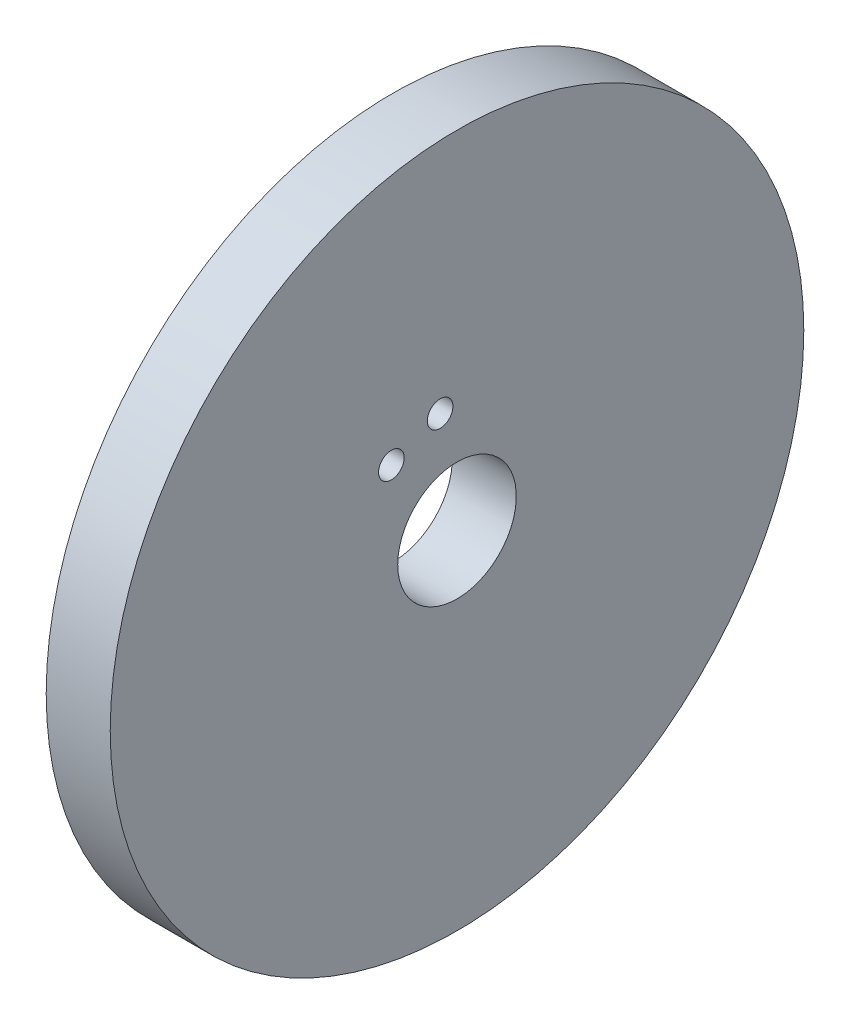
ISO-10303-21;
HEADER;
FILE_DESCRIPTION(('STEP AP214'),'2;1');
FILE_NAME('part.step','',(''),(''),'','','');
FILE_SCHEMA(('AUTOMOTIVE_DESIGN { 1 0 10303 214 1 1 1 1 }'));
ENDSEC;
DATA;
#1=APPLICATION_CONTEXT('core data for automotive mechanical design processes');
#2=APPLICATION_PROTOCOL_DEFINITION('international standard','automotive_design',2000,#1);
#3=PRODUCT_CONTEXT('',#1,'mechanical');
#4=PRODUCT('Part','Part','',(#3));
#5=PRODUCT_RELATED_PRODUCT_CATEGORY('part','',(#4));
#6=PRODUCT_DEFINITION_FORMATION('','',#4);
#7=PRODUCT_DEFINITION_CONTEXT('part definition',#1,'design');
#8=PRODUCT_DEFINITION('design','',#6,#7);
#9=PRODUCT_DEFINITION_SHAPE('','',#8);
#10=(LENGTH_UNIT() NAMED_UNIT(*) SI_UNIT(.MILLI.,.METRE.));
#11=(NAMED_UNIT(*) PLANE_ANGLE_UNIT() SI_UNIT($,.RADIAN.));
#12=(NAMED_UNIT(*) SI_UNIT($,.STERADIAN.) SOLID_ANGLE_UNIT());
#13=UNCERTAINTY_MEASURE_WITH_UNIT(LENGTH_MEASURE(1.E-05),#10,'distance_accuracy_value','');
#14=(GEOMETRIC_REPRESENTATION_CONTEXT(3) GLOBAL_UNCERTAINTY_ASSIGNED_CONTEXT((#13)) GLOBAL_UNIT_ASSIGNED_CONTEXT((#10,
#11,#12)) REPRESENTATION_CONTEXT('',''));
#15=CARTESIAN_POINT('',(0.,0.,0.));
#16=DIRECTION('',(0.,0.,1.));
#17=DIRECTION('',(1.,0.,0.));
#18=AXIS2_PLACEMENT_3D('',#15,#16,#17);
#19=CARTESIAN_POINT('',(13.7,65.,0.));
#20=DIRECTION('',(1.,0.,0.));
#21=DIRECTION('',(0.,0.,-1.));
#22=AXIS2_PLACEMENT_3D('',#19,#20,#21);
#23=PLANE('',#22);
#24=CARTESIAN_POINT('',(13.7,31.8198051533946,-31.8198051533946));
#25=DIRECTION('',(1.,0.,0.));
#26=DIRECTION('',(0.,0.,-1.));
#27=AXIS2_PLACEMENT_3D('',#24,#25,#26);
#28=CIRCLE('',#27,1.55);
#29=CARTESIAN_POINT('',(13.7,31.8198051533946,-33.3698051533946));
#30=VERTEX_POINT('',#29);
#31=EDGE_CURVE('E69',#30,#30,#28,.T.);
#32=ORIENTED_EDGE('',*,*,#31,.T.);
#33=EDGE_LOOP('',(#32));
#34=FACE_BOUND('',#33,.T.);
#35=CARTESIAN_POINT('',(13.7,-31.8198051533946,-31.8198051533946));
#36=DIRECTION('',(1.,0.,0.));
#37=DIRECTION('',(0.,0.,-1.));
#38=AXIS2_PLACEMENT_3D('',#35,#36,#37);
#39=CIRCLE('',#38,1.55);
#40=CARTESIAN_POINT('',(13.7,-31.8198051533946,-33.3698051533946));
#41=VERTEX_POINT('',#40);
#42=EDGE_CURVE('E75',#41,#41,#39,.T.);
#43=ORIENTED_EDGE('',*,*,#42,.T.);
#44=EDGE_LOOP('',(#43));
#45=FACE_BOUND('',#44,.T.);
#46=CARTESIAN_POINT('',(13.7,-31.8198051533946,31.8198051533946));
#47=DIRECTION('',(1.,0.,0.));
#48=DIRECTION('',(0.,0.,-1.));
#49=AXIS2_PLACEMENT_3D('',#46,#47,#48);
#50=CIRCLE('',#49,1.55);
#51=CARTESIAN_POINT('',(13.7,-31.8198051533946,30.2698051533946));
#52=VERTEX_POINT('',#51);
#53=EDGE_CURVE('E81',#52,#52,#50,.T.);
#54=ORIENTED_EDGE('',*,*,#53,.T.);
#55=EDGE_LOOP('',(#54));
#56=FACE_BOUND('',#55,.T.);
#57=CARTESIAN_POINT('',(13.7,31.8198051533946,31.8198051533946));
#58=DIRECTION('',(1.,0.,0.));
#59=DIRECTION('',(0.,0.,-1.));
#60=AXIS2_PLACEMENT_3D('',#57,#58,#59);
#61=CIRCLE('',#60,1.55);
#62=CARTESIAN_POINT('',(13.7,31.8198051533946,30.2698051533946));
#63=VERTEX_POINT('',#62);
#64=EDGE_CURVE('E63',#63,#63,#61,.T.);
#65=ORIENTED_EDGE('',*,*,#64,.T.);
#66=EDGE_LOOP('',(#65));
#67=FACE_BOUND('',#66,.T.);
#68=CARTESIAN_POINT('',(13.7,20.5579739264658,3.16381226351266));
#69=DIRECTION('',(1.,0.,0.));
#70=DIRECTION('',(0.,0.,-1.));
#71=AXIS2_PLACEMENT_3D('',#68,#69,#70);
#72=CIRCLE('',#71,2.4);
#73=CARTESIAN_POINT('',(13.7,20.5579739264658,0.763812263512656));
#74=VERTEX_POINT('',#73);
#75=EDGE_CURVE('E50',#74,#74,#72,.F.);
#76=ORIENTED_EDGE('',*,*,#75,.F.);
#77=EDGE_LOOP('',(#76));
#78=FACE_BOUND('',#77,.T.);
#79=CARTESIAN_POINT('',(13.7,16.7738358767911,12.2995296649292));
#80=DIRECTION('',(1.,0.,0.));
#81=DIRECTION('',(0.,0.,-1.));
#82=AXIS2_PLACEMENT_3D('',#79,#80,#81);
#83=CIRCLE('',#82,2.4);
#84=CARTESIAN_POINT('',(13.7,16.7738358767911,9.89952966492923));
#85=VERTEX_POINT('',#84);
#86=EDGE_CURVE('E53',#85,#85,#83,.F.);
#87=ORIENTED_EDGE('',*,*,#86,.F.);
#88=EDGE_LOOP('',(#87));
#89=FACE_BOUND('',#88,.T.);
#90=CARTESIAN_POINT('',(13.7,0.,0.));
#91=DIRECTION('',(-1.,0.,0.));
#92=DIRECTION('',(0.,0.,1.));
#93=AXIS2_PLACEMENT_3D('',#90,#91,#92);
#94=CIRCLE('',#93,11.1125);
#95=CARTESIAN_POINT('',(13.7,0.,11.1125));
#96=VERTEX_POINT('',#95);
#97=EDGE_CURVE('E10',#96,#96,#94,.T.);
#98=ORIENTED_EDGE('',*,*,#97,.F.);
#99=EDGE_LOOP('',(#98));
#100=FACE_BOUND('',#99,.T.);
#101=CARTESIAN_POINT('',(13.7,0.,0.));
#102=DIRECTION('',(-1.,0.,0.));
#103=DIRECTION('',(0.,0.,1.));
#104=AXIS2_PLACEMENT_3D('',#101,#102,#103);
#105=CIRCLE('',#104,65.);
#106=CARTESIAN_POINT('',(13.7,0.,65.));
#107=VERTEX_POINT('',#106);
#108=EDGE_CURVE('E45',#107,#107,#105,.T.);
#109=ORIENTED_EDGE('',*,*,#108,.T.);
#110=EDGE_LOOP('',(#109));
#111=FACE_BOUND('',#110,.T.);
#112=ADVANCED_FACE('F31',(#34,#45,#56,#67,#78,#89,#100,#111),#23,.F.);
#113=CARTESIAN_POINT('',(-110.,0.,0.));
#114=DIRECTION('',(-1.,0.,0.));
#115=DIRECTION('',(0.,0.,1.));
#116=AXIS2_PLACEMENT_3D('',#113,#114,#115);
#117=CYLINDRICAL_SURFACE('',#116,11.1125);
#118=CARTESIAN_POINT('',(25.7,0.,0.));
#119=DIRECTION('',(-1.,0.,0.));
#120=DIRECTION('',(0.,0.,1.));
#121=AXIS2_PLACEMENT_3D('',#118,#119,#120);
#122=CIRCLE('',#121,11.1125);
#123=CARTESIAN_POINT('',(25.7,0.,11.1125));
#124=VERTEX_POINT('',#123);
#125=EDGE_CURVE('E37',#124,#124,#122,.T.);
#126=ORIENTED_EDGE('',*,*,#125,.F.);
#127=EDGE_LOOP('',(#126));
#128=FACE_BOUND('',#127,.T.);
#129=ORIENTED_EDGE('',*,*,#97,.T.);
#130=EDGE_LOOP('',(#129));
#131=FACE_BOUND('',#130,.T.);
#132=ADVANCED_FACE('F104',(#128,#131),#117,.F.);
#133=CARTESIAN_POINT('',(25.7,11.1125,0.));
#134=DIRECTION('',(-1.,0.,0.));
#135=DIRECTION('',(0.,0.,1.));
#136=AXIS2_PLACEMENT_3D('',#133,#134,#135);
#137=PLANE('',#136);
#138=CARTESIAN_POINT('',(25.7,20.5579739264658,3.16381226351266));
#139=DIRECTION('',(1.,0.,0.));
#140=DIRECTION('',(0.,0.,-1.));
#141=AXIS2_PLACEMENT_3D('',#138,#139,#140);
#142=CIRCLE('',#141,2.4);
#143=CARTESIAN_POINT('',(25.7,20.5579739264658,0.763812263512656));
#144=VERTEX_POINT('',#143);
#145=EDGE_CURVE('E56',#144,#144,#142,.T.);
#146=ORIENTED_EDGE('',*,*,#145,.F.);
#147=EDGE_LOOP('',(#146));
#148=FACE_BOUND('',#147,.T.);
#149=CARTESIAN_POINT('',(25.7,16.7738358767911,12.2995296649292));
#150=DIRECTION('',(1.,0.,0.));
#151=DIRECTION('',(0.,0.,-1.));
#152=AXIS2_PLACEMENT_3D('',#149,#150,#151);
#153=CIRCLE('',#152,2.4);
#154=CARTESIAN_POINT('',(25.7,16.7738358767911,9.89952966492923));
#155=VERTEX_POINT('',#154);
#156=EDGE_CURVE('E57',#155,#155,#153,.T.);
#157=ORIENTED_EDGE('',*,*,#156,.F.);
#158=EDGE_LOOP('',(#157));
#159=FACE_BOUND('',#158,.T.);
#160=CARTESIAN_POINT('',(25.7,0.,0.));
#161=DIRECTION('',(-1.,0.,0.));
#162=DIRECTION('',(0.,0.,1.));
#163=AXIS2_PLACEMENT_3D('',#160,#161,#162);
#164=CIRCLE('',#163,65.);
#165=CARTESIAN_POINT('',(25.7,0.,65.));
#166=VERTEX_POINT('',#165);
#167=EDGE_CURVE('E41',#166,#166,#164,.T.);
#168=ORIENTED_EDGE('',*,*,#167,.F.);
#169=EDGE_LOOP('',(#168));
#170=FACE_BOUND('',#169,.T.);
#171=ORIENTED_EDGE('',*,*,#125,.T.);
#172=EDGE_LOOP('',(#171));
#173=FACE_BOUND('',#172,.T.);
#174=ADVANCED_FACE('F109',(#148,#159,#170,#173),#137,.F.);
#175=CARTESIAN_POINT('',(-110.,0.,0.));
#176=DIRECTION('',(-1.,0.,0.));
#177=DIRECTION('',(0.,0.,1.));
#178=AXIS2_PLACEMENT_3D('',#175,#176,#177);
#179=CYLINDRICAL_SURFACE('',#178,65.);
#180=ORIENTED_EDGE('',*,*,#108,.F.);
#181=EDGE_LOOP('',(#180));
#182=FACE_BOUND('',#181,.T.);
#183=ORIENTED_EDGE('',*,*,#167,.T.);
#184=EDGE_LOOP('',(#183));
#185=FACE_BOUND('',#184,.T.);
#186=ADVANCED_FACE('F126',(#182,#185),#179,.T.);
#187=CARTESIAN_POINT('',(25.7,16.7738358767911,12.2995296649292));
#188=DIRECTION('',(-1.,0.,0.));
#189=DIRECTION('',(0.,0.,1.));
#190=AXIS2_PLACEMENT_3D('',#187,#188,#189);
#191=CYLINDRICAL_SURFACE('',#190,2.4);
#192=ORIENTED_EDGE('',*,*,#156,.T.);
#193=EDGE_LOOP('',(#192));
#194=FACE_BOUND('',#193,.T.);
#195=ORIENTED_EDGE('',*,*,#86,.T.);
#196=EDGE_LOOP('',(#195));
#197=FACE_BOUND('',#196,.T.);
#198=ADVANCED_FACE('F129',(#194,#197),#191,.F.);
#199=CARTESIAN_POINT('',(25.7,20.5579739264658,3.16381226351266));
#200=DIRECTION('',(-1.,0.,0.));
#201=DIRECTION('',(0.,0.,1.));
#202=AXIS2_PLACEMENT_3D('',#199,#200,#201);
#203=CYLINDRICAL_SURFACE('',#202,2.4);
#204=ORIENTED_EDGE('',*,*,#145,.T.);
#205=EDGE_LOOP('',(#204));
#206=FACE_BOUND('',#205,.T.);
#207=ORIENTED_EDGE('',*,*,#75,.T.);
#208=EDGE_LOOP('',(#207));
#209=FACE_BOUND('',#208,.T.);
#210=ADVANCED_FACE('F143',(#206,#209),#203,.F.);
#211=CARTESIAN_POINT('',(20.7,31.8198051533946,31.8198051533946));
#212=DIRECTION('',(-1.,0.,0.));
#213=DIRECTION('',(0.,0.,1.));
#214=AXIS2_PLACEMENT_3D('',#211,#212,#213);
#215=CYLINDRICAL_SURFACE('',#214,1.55);
#216=CARTESIAN_POINT('',(20.7,31.8198051533946,31.8198051533946));
#217=DIRECTION('',(1.,0.,0.));
#218=DIRECTION('',(0.,0.,-1.));
#219=AXIS2_PLACEMENT_3D('',#216,#217,#218);
#220=CIRCLE('',#219,1.55);
#221=CARTESIAN_POINT('',(20.7,31.8198051533946,30.2698051533946));
#222=VERTEX_POINT('',#221);
#223=EDGE_CURVE('E60',#222,#222,#220,.T.);
#224=ORIENTED_EDGE('',*,*,#223,.T.);
#225=EDGE_LOOP('',(#224));
#226=FACE_BOUND('',#225,.T.);
#227=ORIENTED_EDGE('',*,*,#64,.F.);
#228=EDGE_LOOP('',(#227));
#229=FACE_BOUND('',#228,.T.);
#230=ADVANCED_FACE('F147',(#226,#229),#215,.F.);
#231=CARTESIAN_POINT('',(20.7,31.8198051533946,31.8198051533946));
#232=DIRECTION('',(1.,0.,0.));
#233=DIRECTION('',(0.,0.,-1.));
#234=AXIS2_PLACEMENT_3D('',#231,#232,#233);
#235=PLANE('',#234);
#236=ORIENTED_EDGE('',*,*,#223,.F.);
#237=EDGE_LOOP('',(#236));
#238=FACE_BOUND('',#237,.T.);
#239=ADVANCED_FACE('F101',(#238),#235,.F.);
#240=CARTESIAN_POINT('',(20.7,-31.8198051533946,31.8198051533946));
#241=DIRECTION('',(-1.,0.,0.));
#242=DIRECTION('',(0.,0.,1.));
#243=AXIS2_PLACEMENT_3D('',#240,#241,#242);
#244=CYLINDRICAL_SURFACE('',#243,1.55);
#245=CARTESIAN_POINT('',(20.7,-31.8198051533946,31.8198051533946));
#246=DIRECTION('',(1.,0.,0.));
#247=DIRECTION('',(0.,0.,-1.));
#248=AXIS2_PLACEMENT_3D('',#245,#246,#247);
#249=CIRCLE('',#248,1.55);
#250=CARTESIAN_POINT('',(20.7,-31.8198051533946,30.2698051533946));
#251=VERTEX_POINT('',#250);
#252=EDGE_CURVE('E66',#251,#251,#249,.T.);
#253=ORIENTED_EDGE('',*,*,#252,.T.);
#254=EDGE_LOOP('',(#253));
#255=FACE_BOUND('',#254,.T.);
#256=ORIENTED_EDGE('',*,*,#53,.F.);
#257=EDGE_LOOP('',(#256));
#258=FACE_BOUND('',#257,.T.);
#259=ADVANCED_FACE('F87',(#255,#258),#244,.F.);
#260=CARTESIAN_POINT('',(20.7,-31.8198051533946,31.8198051533946));
#261=DIRECTION('',(1.,0.,0.));
#262=DIRECTION('',(0.,0.,-1.));
#263=AXIS2_PLACEMENT_3D('',#260,#261,#262);
#264=PLANE('',#263);
#265=ORIENTED_EDGE('',*,*,#252,.F.);
#266=EDGE_LOOP('',(#265));
#267=FACE_BOUND('',#266,.T.);
#268=ADVANCED_FACE('F90',(#267),#264,.F.);
#269=CARTESIAN_POINT('',(20.7,-31.8198051533946,-31.8198051533946));
#270=DIRECTION('',(-1.,0.,0.));
#271=DIRECTION('',(0.,0.,1.));
#272=AXIS2_PLACEMENT_3D('',#269,#270,#271);
#273=CYLINDRICAL_SURFACE('',#272,1.55);
#274=CARTESIAN_POINT('',(20.7,-31.8198051533946,-31.8198051533946));
#275=DIRECTION('',(1.,0.,0.));
#276=DIRECTION('',(0.,0.,-1.));
#277=AXIS2_PLACEMENT_3D('',#274,#275,#276);
#278=CIRCLE('',#277,1.55);
#279=CARTESIAN_POINT('',(20.7,-31.8198051533946,-33.3698051533946));
#280=VERTEX_POINT('',#279);
#281=EDGE_CURVE('E78',#280,#280,#278,.T.);
#282=ORIENTED_EDGE('',*,*,#281,.T.);
#283=EDGE_LOOP('',(#282));
#284=FACE_BOUND('',#283,.T.);
#285=ORIENTED_EDGE('',*,*,#42,.F.);
#286=EDGE_LOOP('',(#285));
#287=FACE_BOUND('',#286,.T.);
#288=ADVANCED_FACE('F92',(#284,#287),#273,.F.);
#289=CARTESIAN_POINT('',(20.7,-31.8198051533946,-31.8198051533946));
#290=DIRECTION('',(1.,0.,0.));
#291=DIRECTION('',(0.,0.,-1.));
#292=AXIS2_PLACEMENT_3D('',#289,#290,#291);
#293=PLANE('',#292);
#294=ORIENTED_EDGE('',*,*,#281,.F.);
#295=EDGE_LOOP('',(#294));
#296=FACE_BOUND('',#295,.T.);
#297=ADVANCED_FACE('F98',(#296),#293,.F.);
#298=CARTESIAN_POINT('',(20.7,31.8198051533946,-31.8198051533946));
#299=DIRECTION('',(-1.,0.,0.));
#300=DIRECTION('',(0.,0.,1.));
#301=AXIS2_PLACEMENT_3D('',#298,#299,#300);
#302=CYLINDRICAL_SURFACE('',#301,1.55);
#303=CARTESIAN_POINT('',(20.7,31.8198051533946,-31.8198051533946));
#304=DIRECTION('',(1.,0.,0.));
#305=DIRECTION('',(0.,0.,-1.));
#306=AXIS2_PLACEMENT_3D('',#303,#304,#305);
#307=CIRCLE('',#306,1.55);
#308=CARTESIAN_POINT('',(20.7,31.8198051533946,-33.3698051533946));
#309=VERTEX_POINT('',#308);
#310=EDGE_CURVE('E72',#309,#309,#307,.T.);
#311=ORIENTED_EDGE('',*,*,#310,.T.);
#312=EDGE_LOOP('',(#311));
#313=FACE_BOUND('',#312,.T.);
#314=ORIENTED_EDGE('',*,*,#31,.F.);
#315=EDGE_LOOP('',(#314));
#316=FACE_BOUND('',#315,.T.);
#317=ADVANCED_FACE('F155',(#313,#316),#302,.F.);
#318=CARTESIAN_POINT('',(20.7,31.8198051533946,-31.8198051533946));
#319=DIRECTION('',(1.,0.,0.));
#320=DIRECTION('',(0.,0.,-1.));
#321=AXIS2_PLACEMENT_3D('',#318,#319,#320);
#322=PLANE('',#321);
#323=ORIENTED_EDGE('',*,*,#310,.F.);
#324=EDGE_LOOP('',(#323));
#325=FACE_BOUND('',#324,.T.);
#326=ADVANCED_FACE('F158',(#325),#322,.F.);
#327=CLOSED_SHELL('',(#112,#132,#174,#186,#198,#210,#230,#239,#259,#268,#288,#297,#317,#326));
#328=MANIFOLD_SOLID_BREP('B2',#327);
#329=ADVANCED_BREP_SHAPE_REPRESENTATION('',(#18,#328),#14);
#330=SHAPE_DEFINITION_REPRESENTATION(#9,#329);
ENDSEC;
END-ISO-10303-21;
